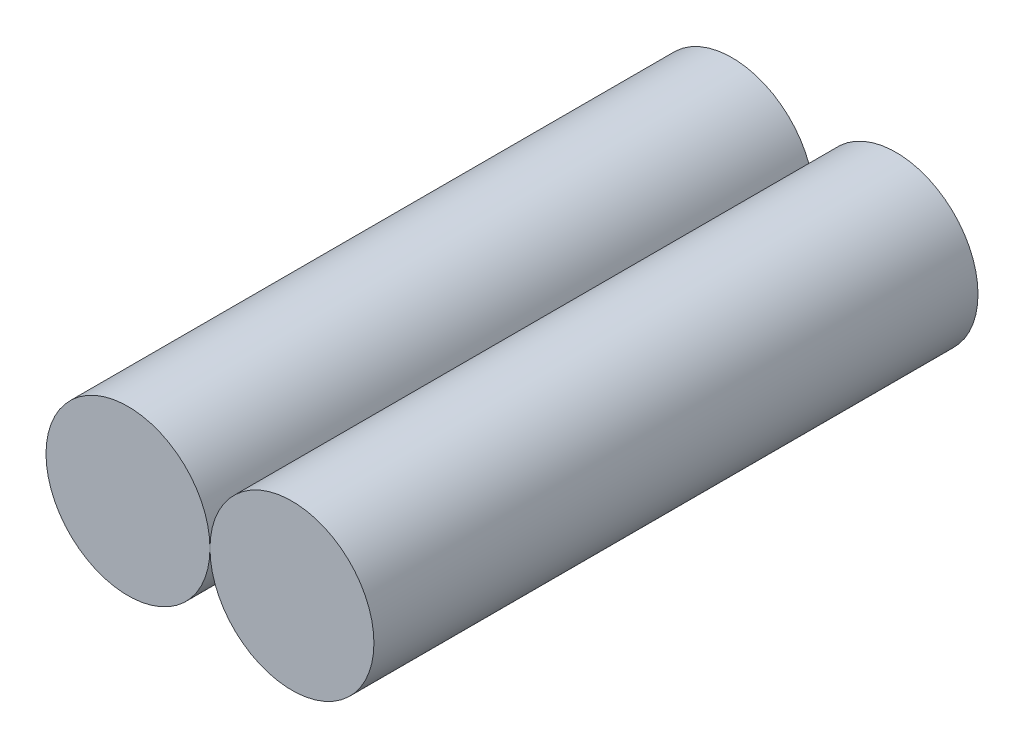
ISO-10303-21;
HEADER;
FILE_DESCRIPTION(('STEP AP214'),'2;1');
FILE_NAME('part.step','',(''),(''),'','','');
FILE_SCHEMA(('AUTOMOTIVE_DESIGN { 1 0 10303 214 1 1 1 1 }'));
ENDSEC;
DATA;
#1=APPLICATION_CONTEXT('core data for automotive mechanical design processes');
#2=APPLICATION_PROTOCOL_DEFINITION('international standard','automotive_design',2000,#1);
#3=PRODUCT_CONTEXT('',#1,'mechanical');
#4=PRODUCT('Part','Part','',(#3));
#5=PRODUCT_RELATED_PRODUCT_CATEGORY('part','',(#4));
#6=PRODUCT_DEFINITION_FORMATION('','',#4);
#7=PRODUCT_DEFINITION_CONTEXT('part definition',#1,'design');
#8=PRODUCT_DEFINITION('design','',#6,#7);
#9=PRODUCT_DEFINITION_SHAPE('','',#8);
#10=(LENGTH_UNIT() NAMED_UNIT(*) SI_UNIT(.MILLI.,.METRE.));
#11=(NAMED_UNIT(*) PLANE_ANGLE_UNIT() SI_UNIT($,.RADIAN.));
#12=(NAMED_UNIT(*) SI_UNIT($,.STERADIAN.) SOLID_ANGLE_UNIT());
#13=UNCERTAINTY_MEASURE_WITH_UNIT(LENGTH_MEASURE(1.E-05),#10,'distance_accuracy_value','');
#14=(GEOMETRIC_REPRESENTATION_CONTEXT(3) GLOBAL_UNCERTAINTY_ASSIGNED_CONTEXT((#13)) GLOBAL_UNIT_ASSIGNED_CONTEXT((#10,
#11,#12)) REPRESENTATION_CONTEXT('',''));
#15=CARTESIAN_POINT('',(0.,0.,0.));
#16=DIRECTION('',(0.,0.,1.));
#17=DIRECTION('',(1.,0.,0.));
#18=AXIS2_PLACEMENT_3D('',#15,#16,#17);
#19=CARTESIAN_POINT('',(-19.,0.,-35.));
#20=DIRECTION('',(0.,0.,1.));
#21=DIRECTION('',(1.,0.,0.));
#22=AXIS2_PLACEMENT_3D('',#19,#20,#21);
#23=CYLINDRICAL_SURFACE('',#22,9.5);
#24=CARTESIAN_POINT('',(-19.,0.,-35.));
#25=DIRECTION('',(0.,0.,1.));
#26=DIRECTION('',(1.,0.,0.));
#27=AXIS2_PLACEMENT_3D('',#24,#25,#26);
#28=CIRCLE('',#27,9.5);
#29=CARTESIAN_POINT('',(-9.5,0.,-35.));
#30=VERTEX_POINT('',#29);
#31=EDGE_CURVE('E11',#30,#30,#28,.T.);
#32=ORIENTED_EDGE('',*,*,#31,.T.);
#33=EDGE_LOOP('',(#32));
#34=FACE_BOUND('',#33,.T.);
#35=CARTESIAN_POINT('',(-19.,0.,35.));
#36=DIRECTION('',(0.,0.,1.));
#37=DIRECTION('',(1.,0.,0.));
#38=AXIS2_PLACEMENT_3D('',#35,#36,#37);
#39=CIRCLE('',#38,9.5);
#40=CARTESIAN_POINT('',(-9.5,0.,35.));
#41=VERTEX_POINT('',#40);
#42=EDGE_CURVE('E47',#41,#41,#39,.T.);
#43=ORIENTED_EDGE('',*,*,#42,.F.);
#44=EDGE_LOOP('',(#43));
#45=FACE_BOUND('',#44,.T.);
#46=ADVANCED_FACE('F41',(#34,#45),#23,.T.);
#47=CARTESIAN_POINT('',(0.,0.,-35.));
#48=DIRECTION('',(0.,0.,1.));
#49=DIRECTION('',(1.,0.,0.));
#50=AXIS2_PLACEMENT_3D('',#47,#48,#49);
#51=PLANE('',#50);
#52=ORIENTED_EDGE('',*,*,#31,.F.);
#53=EDGE_LOOP('',(#52));
#54=FACE_BOUND('',#53,.T.);
#55=ADVANCED_FACE('F56',(#54),#51,.F.);
#56=CARTESIAN_POINT('',(0.,0.,35.));
#57=DIRECTION('',(0.,0.,1.));
#58=DIRECTION('',(1.,0.,0.));
#59=AXIS2_PLACEMENT_3D('',#56,#57,#58);
#60=PLANE('',#59);
#61=ORIENTED_EDGE('',*,*,#42,.T.);
#62=EDGE_LOOP('',(#61));
#63=FACE_BOUND('',#62,.T.);
#64=ADVANCED_FACE('F53',(#63),#60,.T.);
#65=CLOSED_SHELL('',(#46,#55,#64));
#66=MANIFOLD_SOLID_BREP('B2',#65);
#67=CARTESIAN_POINT('',(0.,0.,-35.));
#68=DIRECTION('',(0.,0.,1.));
#69=DIRECTION('',(1.,0.,0.));
#70=AXIS2_PLACEMENT_3D('',#67,#68,#69);
#71=CYLINDRICAL_SURFACE('',#70,9.5);
#72=CARTESIAN_POINT('',(0.,0.,-35.));
#73=DIRECTION('',(0.,0.,1.));
#74=DIRECTION('',(1.,0.,0.));
#75=AXIS2_PLACEMENT_3D('',#72,#73,#74);
#76=CIRCLE('',#75,9.5);
#77=CARTESIAN_POINT('',(9.5,0.,-35.));
#78=VERTEX_POINT('',#77);
#79=EDGE_CURVE('E40',#78,#78,#76,.T.);
#80=ORIENTED_EDGE('',*,*,#79,.T.);
#81=EDGE_LOOP('',(#80));
#82=FACE_BOUND('',#81,.T.);
#83=CARTESIAN_POINT('',(0.,0.,35.));
#84=DIRECTION('',(0.,0.,1.));
#85=DIRECTION('',(1.,0.,0.));
#86=AXIS2_PLACEMENT_3D('',#83,#84,#85);
#87=CIRCLE('',#86,9.5);
#88=CARTESIAN_POINT('',(9.5,0.,35.));
#89=VERTEX_POINT('',#88);
#90=EDGE_CURVE('E106',#89,#89,#87,.T.);
#91=ORIENTED_EDGE('',*,*,#90,.F.);
#92=EDGE_LOOP('',(#91));
#93=FACE_BOUND('',#92,.T.);
#94=ADVANCED_FACE('F100',(#82,#93),#71,.T.);
#95=CARTESIAN_POINT('',(0.,0.,-35.));
#96=DIRECTION('',(0.,0.,1.));
#97=DIRECTION('',(1.,0.,0.));
#98=AXIS2_PLACEMENT_3D('',#95,#96,#97);
#99=PLANE('',#98);
#100=ORIENTED_EDGE('',*,*,#79,.F.);
#101=EDGE_LOOP('',(#100));
#102=FACE_BOUND('',#101,.T.);
#103=ADVANCED_FACE('F115',(#102),#99,.F.);
#104=CARTESIAN_POINT('',(0.,0.,35.));
#105=DIRECTION('',(0.,0.,1.));
#106=DIRECTION('',(1.,0.,0.));
#107=AXIS2_PLACEMENT_3D('',#104,#105,#106);
#108=PLANE('',#107);
#109=ORIENTED_EDGE('',*,*,#90,.T.);
#110=EDGE_LOOP('',(#109));
#111=FACE_BOUND('',#110,.T.);
#112=ADVANCED_FACE('F112',(#111),#108,.T.);
#113=CLOSED_SHELL('',(#94,#103,#112));
#114=MANIFOLD_SOLID_BREP('B6',#113);
#115=ADVANCED_BREP_SHAPE_REPRESENTATION('',(#18,#66,#114),#14);
#116=SHAPE_DEFINITION_REPRESENTATION(#9,#115);
ENDSEC;
END-ISO-10303-21;
